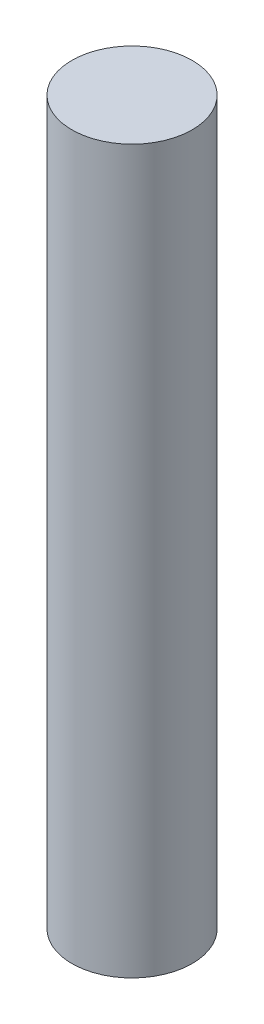
ISO-10303-21;
HEADER;
FILE_DESCRIPTION(('STEP AP214'),'2;1');
FILE_NAME('part.step','',(''),(''),'','','');
FILE_SCHEMA(('AUTOMOTIVE_DESIGN { 1 0 10303 214 1 1 1 1 }'));
ENDSEC;
DATA;
#1=APPLICATION_CONTEXT('core data for automotive mechanical design processes');
#2=APPLICATION_PROTOCOL_DEFINITION('international standard','automotive_design',2000,#1);
#3=PRODUCT_CONTEXT('',#1,'mechanical');
#4=PRODUCT('Part','Part','',(#3));
#5=PRODUCT_RELATED_PRODUCT_CATEGORY('part','',(#4));
#6=PRODUCT_DEFINITION_FORMATION('','',#4);
#7=PRODUCT_DEFINITION_CONTEXT('part definition',#1,'design');
#8=PRODUCT_DEFINITION('design','',#6,#7);
#9=PRODUCT_DEFINITION_SHAPE('','',#8);
#10=(LENGTH_UNIT() NAMED_UNIT(*) SI_UNIT(.MILLI.,.METRE.));
#11=(NAMED_UNIT(*) PLANE_ANGLE_UNIT() SI_UNIT($,.RADIAN.));
#12=(NAMED_UNIT(*) SI_UNIT($,.STERADIAN.) SOLID_ANGLE_UNIT());
#13=UNCERTAINTY_MEASURE_WITH_UNIT(LENGTH_MEASURE(1.E-05),#10,'distance_accuracy_value','');
#14=(GEOMETRIC_REPRESENTATION_CONTEXT(3) GLOBAL_UNCERTAINTY_ASSIGNED_CONTEXT((#13)) GLOBAL_UNIT_ASSIGNED_CONTEXT((#10,
#11,#12)) REPRESENTATION_CONTEXT('',''));
#15=CARTESIAN_POINT('',(0.,0.,0.));
#16=DIRECTION('',(0.,0.,1.));
#17=DIRECTION('',(1.,0.,0.));
#18=AXIS2_PLACEMENT_3D('',#15,#16,#17);
#19=CARTESIAN_POINT('',(0.,152.4,0.));
#20=DIRECTION('',(0.,-1.,0.));
#21=DIRECTION('',(0.,0.,-1.));
#22=AXIS2_PLACEMENT_3D('',#19,#20,#21);
#23=CYLINDRICAL_SURFACE('',#22,12.7);
#24=CARTESIAN_POINT('',(0.,152.4,0.));
#25=DIRECTION('',(0.,1.,0.));
#26=DIRECTION('',(0.,0.,1.));
#27=AXIS2_PLACEMENT_3D('',#24,#25,#26);
#28=CIRCLE('',#27,12.7);
#29=CARTESIAN_POINT('',(0.,152.4,-12.7));
#30=VERTEX_POINT('',#29);
#31=EDGE_CURVE('E10',#30,#30,#28,.T.);
#32=CARTESIAN_POINT('',(0.,0.,0.));
#33=DIRECTION('',(0.,1.,0.));
#34=DIRECTION('',(0.,0.,1.));
#35=AXIS2_PLACEMENT_3D('',#32,#33,#34);
#36=CIRCLE('',#35,12.7);
#37=CARTESIAN_POINT('',(0.,0.,-12.7));
#38=VERTEX_POINT('',#37);
#39=EDGE_CURVE('E34',#38,#38,#36,.T.);
#40=CARTESIAN_POINT('',(0.,152.4,-12.7));
#41=CARTESIAN_POINT('',(0.,150.8125,-12.7));
#42=CARTESIAN_POINT('',(0.,149.225,-12.7));
#43=CARTESIAN_POINT('',(0.,146.05,-12.7));
#44=CARTESIAN_POINT('',(0.,144.4625,-12.7));
#45=CARTESIAN_POINT('',(0.,141.2875,-12.7));
#46=CARTESIAN_POINT('',(0.,139.7,-12.7));
#47=CARTESIAN_POINT('',(0.,136.525,-12.7));
#48=CARTESIAN_POINT('',(0.,134.9375,-12.7));
#49=CARTESIAN_POINT('',(0.,131.7625,-12.7));
#50=CARTESIAN_POINT('',(0.,130.175,-12.7));
#51=CARTESIAN_POINT('',(0.,127.,-12.7));
#52=CARTESIAN_POINT('',(0.,125.4125,-12.7));
#53=CARTESIAN_POINT('',(0.,122.2375,-12.7));
#54=CARTESIAN_POINT('',(0.,120.65,-12.7));
#55=CARTESIAN_POINT('',(0.,117.475,-12.7));
#56=CARTESIAN_POINT('',(0.,115.8875,-12.7));
#57=CARTESIAN_POINT('',(0.,112.7125,-12.7));
#58=CARTESIAN_POINT('',(0.,111.125,-12.7));
#59=CARTESIAN_POINT('',(0.,107.95,-12.7));
#60=CARTESIAN_POINT('',(0.,106.3625,-12.7));
#61=CARTESIAN_POINT('',(0.,103.1875,-12.7));
#62=CARTESIAN_POINT('',(0.,101.6,-12.7));
#63=CARTESIAN_POINT('',(0.,98.425,-12.7));
#64=CARTESIAN_POINT('',(0.,96.8375,-12.7));
#65=CARTESIAN_POINT('',(0.,93.6625,-12.7));
#66=CARTESIAN_POINT('',(0.,92.075,-12.7));
#67=CARTESIAN_POINT('',(0.,88.9,-12.7));
#68=CARTESIAN_POINT('',(0.,87.3125,-12.7));
#69=CARTESIAN_POINT('',(0.,84.1375,-12.7));
#70=CARTESIAN_POINT('',(0.,82.55,-12.7));
#71=CARTESIAN_POINT('',(0.,79.375,-12.7));
#72=CARTESIAN_POINT('',(0.,77.7875,-12.7));
#73=CARTESIAN_POINT('',(0.,74.6125,-12.7));
#74=CARTESIAN_POINT('',(0.,73.025,-12.7));
#75=CARTESIAN_POINT('',(0.,69.85,-12.7));
#76=CARTESIAN_POINT('',(0.,68.2625,-12.7));
#77=CARTESIAN_POINT('',(0.,65.0875,-12.7));
#78=CARTESIAN_POINT('',(0.,63.5,-12.7));
#79=CARTESIAN_POINT('',(0.,60.325,-12.7));
#80=CARTESIAN_POINT('',(0.,58.7375,-12.7));
#81=CARTESIAN_POINT('',(0.,55.5625,-12.7));
#82=CARTESIAN_POINT('',(0.,53.975,-12.7));
#83=CARTESIAN_POINT('',(0.,50.8,-12.7));
#84=CARTESIAN_POINT('',(0.,49.2125,-12.7));
#85=CARTESIAN_POINT('',(0.,46.0375,-12.7));
#86=CARTESIAN_POINT('',(0.,44.45,-12.7));
#87=CARTESIAN_POINT('',(0.,41.275,-12.7));
#88=CARTESIAN_POINT('',(0.,39.6875,-12.7));
#89=CARTESIAN_POINT('',(0.,36.5125,-12.7));
#90=CARTESIAN_POINT('',(0.,34.925,-12.7));
#91=CARTESIAN_POINT('',(0.,31.75,-12.7));
#92=CARTESIAN_POINT('',(0.,30.1625,-12.7));
#93=CARTESIAN_POINT('',(0.,26.9875,-12.7));
#94=CARTESIAN_POINT('',(0.,25.4,-12.7));
#95=CARTESIAN_POINT('',(0.,22.225,-12.7));
#96=CARTESIAN_POINT('',(0.,20.6375,-12.7));
#97=CARTESIAN_POINT('',(0.,17.4625,-12.7));
#98=CARTESIAN_POINT('',(0.,15.875,-12.7));
#99=CARTESIAN_POINT('',(0.,12.7,-12.7));
#100=CARTESIAN_POINT('',(0.,11.1125,-12.7));
#101=CARTESIAN_POINT('',(0.,7.93750000000001,-12.7));
#102=CARTESIAN_POINT('',(0.,6.35,-12.7));
#103=CARTESIAN_POINT('',(0.,3.175,-12.7));
#104=CARTESIAN_POINT('',(0.,1.5875,-12.7));
#105=CARTESIAN_POINT('',(0.,0.,-12.7));
#106=B_SPLINE_CURVE_WITH_KNOTS('',3,(#40,#41,#42,#43,#44,#45,#46,#47,#48,#49,#50,#51,#52,#53,
#54,#55,#56,#57,#58,#59,#60,#61,#62,#63,#64,#65,#66,#67,#68,#69,#70,#71,#72,#73,#74,#75,#76,#77,
#78,#79,#80,#81,#82,#83,#84,#85,#86,#87,#88,#89,#90,#91,#92,#93,#94,#95,#96,#97,#98,#99,#100,
#101,#102,#103,#104,#105),.UNSPECIFIED.,.F.,.F.,(4,2,2,2,2,2,2,2,2,2,2,2,2,2,2,2,2,2,2,2,2,2,2,
2,2,2,2,2,2,2,2,2,4),(0.,4.76249999999998,9.52499999999998,14.2875,19.05,23.8125,28.575,33.3375,
38.1,42.8625,47.625,52.3875,57.15,61.9125,66.675,71.4375,76.2,80.9625,85.725,90.4875,95.25,
100.0125,104.775,109.5375,114.3,119.0625,123.825,128.5875,133.35,138.1125,142.875,147.6375,
152.4),.UNSPECIFIED.);
#107=EDGE_CURVE('BSEAM31',#30,#38,#106,.T.);
#108=ORIENTED_EDGE('',*,*,#31,.F.);
#109=ORIENTED_EDGE('',*,*,#39,.T.);
#110=ORIENTED_EDGE('',*,*,#107,.T.);
#111=ORIENTED_EDGE('',*,*,#107,.F.);
#112=EDGE_LOOP('',(#108,#110,#109,#111));
#113=FACE_BOUND('',#112,.T.);
#114=ADVANCED_FACE('F31',(#113),#23,.T.);
#115=CARTESIAN_POINT('',(0.,152.4,0.));
#116=DIRECTION('',(0.,1.,0.));
#117=DIRECTION('',(0.,0.,1.));
#118=AXIS2_PLACEMENT_3D('',#115,#116,#117);
#119=PLANE('',#118);
#120=ORIENTED_EDGE('',*,*,#31,.T.);
#121=EDGE_LOOP('',(#120));
#122=FACE_BOUND('',#121,.T.);
#123=ADVANCED_FACE('F46',(#122),#119,.T.);
#124=CARTESIAN_POINT('',(0.,0.,0.));
#125=DIRECTION('',(0.,1.,0.));
#126=DIRECTION('',(0.,0.,1.));
#127=AXIS2_PLACEMENT_3D('',#124,#125,#126);
#128=PLANE('',#127);
#129=ORIENTED_EDGE('',*,*,#39,.F.);
#130=EDGE_LOOP('',(#129));
#131=FACE_BOUND('',#130,.T.);
#132=ADVANCED_FACE('F44',(#131),#128,.F.);
#133=CLOSED_SHELL('',(#114,#123,#132));
#134=MANIFOLD_SOLID_BREP('B2',#133);
#135=ADVANCED_BREP_SHAPE_REPRESENTATION('',(#18,#134),#14);
#136=SHAPE_DEFINITION_REPRESENTATION(#9,#135);
ENDSEC;
END-ISO-10303-21;
